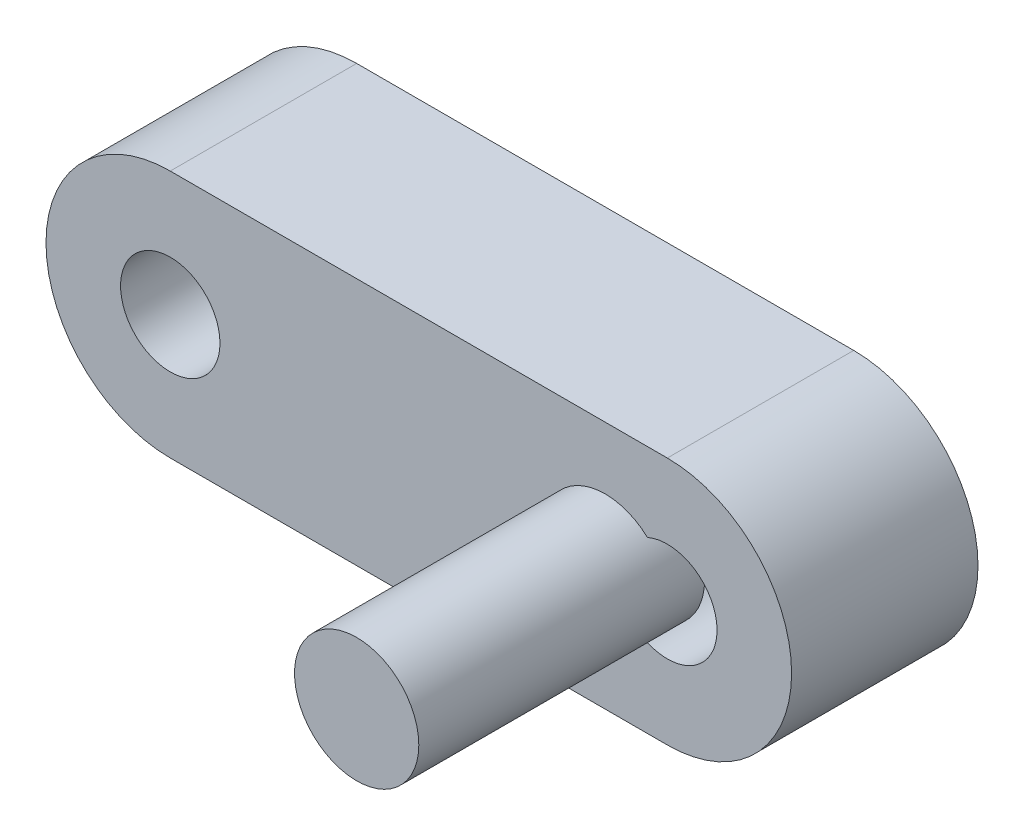
ISO-10303-21;
HEADER;
FILE_DESCRIPTION(('STEP AP214'),'2;1');
FILE_NAME('part.step','',(''),(''),'','','');
FILE_SCHEMA(('AUTOMOTIVE_DESIGN { 1 0 10303 214 1 1 1 1 }'));
ENDSEC;
DATA;
#1=APPLICATION_CONTEXT('core data for automotive mechanical design processes');
#2=APPLICATION_PROTOCOL_DEFINITION('international standard','automotive_design',2000,#1);
#3=PRODUCT_CONTEXT('',#1,'mechanical');
#4=PRODUCT('Part','Part','',(#3));
#5=PRODUCT_RELATED_PRODUCT_CATEGORY('part','',(#4));
#6=PRODUCT_DEFINITION_FORMATION('','',#4);
#7=PRODUCT_DEFINITION_CONTEXT('part definition',#1,'design');
#8=PRODUCT_DEFINITION('design','',#6,#7);
#9=PRODUCT_DEFINITION_SHAPE('','',#8);
#10=(LENGTH_UNIT() NAMED_UNIT(*) SI_UNIT(.MILLI.,.METRE.));
#11=(NAMED_UNIT(*) PLANE_ANGLE_UNIT() SI_UNIT($,.RADIAN.));
#12=(NAMED_UNIT(*) SI_UNIT($,.STERADIAN.) SOLID_ANGLE_UNIT());
#13=UNCERTAINTY_MEASURE_WITH_UNIT(LENGTH_MEASURE(1.E-05),#10,'distance_accuracy_value','');
#14=(GEOMETRIC_REPRESENTATION_CONTEXT(3) GLOBAL_UNCERTAINTY_ASSIGNED_CONTEXT((#13)) GLOBAL_UNIT_ASSIGNED_CONTEXT((#10,
#11,#12)) REPRESENTATION_CONTEXT('',''));
#15=CARTESIAN_POINT('',(0.,0.,0.));
#16=DIRECTION('',(0.,0.,1.));
#17=DIRECTION('',(1.,0.,0.));
#18=AXIS2_PLACEMENT_3D('',#15,#16,#17);
#19=CARTESIAN_POINT('',(10.,0.,7.5));
#20=DIRECTION('',(0.,0.,-1.));
#21=DIRECTION('',(-1.,0.,0.));
#22=AXIS2_PLACEMENT_3D('',#19,#20,#21);
#23=CYLINDRICAL_SURFACE('',#22,2.);
#24=DIRECTION('',(0.,0.,1.));
#25=VECTOR('',#24,1.);
#26=CARTESIAN_POINT('',(9.2,1.83303027798234,11.75));
#27=LINE('',#26,#25);
#28=CARTESIAN_POINT('',(9.2,1.83303027798233,6.));
#29=VERTEX_POINT('',#28);
#30=CARTESIAN_POINT('',(9.2,1.83303027798233,7.5));
#31=VERTEX_POINT('',#30);
#32=EDGE_CURVE('E284',#29,#31,#27,.T.);
#33=ORIENTED_EDGE('',*,*,#32,.F.);
#34=CARTESIAN_POINT('',(10.,0.,6.));
#35=DIRECTION('',(0.,0.,1.));
#36=DIRECTION('',(1.,0.,0.));
#37=AXIS2_PLACEMENT_3D('',#34,#35,#36);
#38=CIRCLE('',#37,2.);
#39=CARTESIAN_POINT('',(9.2,-1.83303027798234,6.));
#40=VERTEX_POINT('',#39);
#41=EDGE_CURVE('E277',#29,#40,#38,.T.);
#42=ORIENTED_EDGE('',*,*,#41,.T.);
#43=DIRECTION('',(0.,0.,1.));
#44=VECTOR('',#43,1.);
#45=CARTESIAN_POINT('',(9.2,-1.83303027798234,11.75));
#46=LINE('',#45,#44);
#47=CARTESIAN_POINT('',(9.2,-1.83303027798234,7.5));
#48=VERTEX_POINT('',#47);
#49=EDGE_CURVE('E281',#48,#40,#46,.F.);
#50=ORIENTED_EDGE('',*,*,#49,.F.);
#51=CARTESIAN_POINT('',(10.,0.,7.5));
#52=DIRECTION('',(0.,0.,1.));
#53=DIRECTION('',(1.,0.,0.));
#54=AXIS2_PLACEMENT_3D('',#51,#52,#53);
#55=CIRCLE('',#54,2.);
#56=EDGE_CURVE('E223',#48,#31,#55,.T.);
#57=ORIENTED_EDGE('',*,*,#56,.T.);
#58=EDGE_LOOP('',(#33,#42,#50,#57));
#59=FACE_BOUND('',#58,.T.);
#60=CARTESIAN_POINT('',(10.,0.,4.));
#61=DIRECTION('',(0.,0.,-1.));
#62=DIRECTION('',(-1.,0.,0.));
#63=AXIS2_PLACEMENT_3D('',#60,#61,#62);
#64=CIRCLE('',#63,2.);
#65=CARTESIAN_POINT('',(8.,0.,4.));
#66=VERTEX_POINT('',#65);
#67=EDGE_CURVE('E197',#66,#66,#64,.T.);
#68=ORIENTED_EDGE('',*,*,#67,.T.);
#69=EDGE_LOOP('',(#68));
#70=FACE_BOUND('',#69,.T.);
#71=ADVANCED_FACE('F43',(#59,#70),#23,.F.);
#72=CARTESIAN_POINT('',(-10.,0.,7.5));
#73=DIRECTION('',(0.,0.,1.));
#74=DIRECTION('',(1.,0.,0.));
#75=AXIS2_PLACEMENT_3D('',#72,#73,#74);
#76=PLANE('',#75);
#77=CARTESIAN_POINT('',(7.5,0.,7.5));
#78=DIRECTION('',(0.,0.,1.));
#79=DIRECTION('',(1.,0.,0.));
#80=AXIS2_PLACEMENT_3D('',#77,#78,#79);
#81=CIRCLE('',#80,2.5);
#82=EDGE_CURVE('E220',#31,#48,#81,.T.);
#83=ORIENTED_EDGE('',*,*,#82,.F.);
#84=ORIENTED_EDGE('',*,*,#56,.F.);
#85=EDGE_LOOP('',(#83,#84));
#86=FACE_BOUND('',#85,.T.);
#87=CARTESIAN_POINT('',(-10.,0.,7.5));
#88=DIRECTION('',(0.,0.,1.));
#89=DIRECTION('',(1.,0.,0.));
#90=AXIS2_PLACEMENT_3D('',#87,#88,#89);
#91=CIRCLE('',#90,2.);
#92=CARTESIAN_POINT('',(-8.,0.,7.5));
#93=VERTEX_POINT('',#92);
#94=EDGE_CURVE('E228',#93,#93,#91,.T.);
#95=ORIENTED_EDGE('',*,*,#94,.F.);
#96=EDGE_LOOP('',(#95));
#97=FACE_BOUND('',#96,.T.);
#98=CARTESIAN_POINT('',(-10.,0.,7.5));
#99=DIRECTION('',(0.,0.,1.));
#100=DIRECTION('',(1.,0.,0.));
#101=AXIS2_PLACEMENT_3D('',#98,#99,#100);
#102=CIRCLE('',#101,5.);
#103=CARTESIAN_POINT('',(-10.,5.,7.5));
#104=VERTEX_POINT('',#103);
#105=CARTESIAN_POINT('',(-10.,-5.,7.5));
#106=VERTEX_POINT('',#105);
#107=EDGE_CURVE('E236',#104,#106,#102,.T.);
#108=ORIENTED_EDGE('',*,*,#107,.T.);
#109=DIRECTION('',(1.,0.,0.));
#110=VECTOR('',#109,1.);
#111=CARTESIAN_POINT('',(-10.,-5.,7.5));
#112=LINE('',#111,#110);
#113=CARTESIAN_POINT('',(10.,-5.,7.5));
#114=VERTEX_POINT('',#113);
#115=EDGE_CURVE('E240',#106,#114,#112,.T.);
#116=ORIENTED_EDGE('',*,*,#115,.T.);
#117=CARTESIAN_POINT('',(10.,0.,7.5));
#118=DIRECTION('',(0.,0.,1.));
#119=DIRECTION('',(1.,0.,0.));
#120=AXIS2_PLACEMENT_3D('',#117,#118,#119);
#121=CIRCLE('',#120,5.);
#122=CARTESIAN_POINT('',(10.,5.,7.5));
#123=VERTEX_POINT('',#122);
#124=EDGE_CURVE('E244',#114,#123,#121,.T.);
#125=ORIENTED_EDGE('',*,*,#124,.T.);
#126=DIRECTION('',(-1.,0.,0.));
#127=VECTOR('',#126,1.);
#128=CARTESIAN_POINT('',(-10.,5.,7.5));
#129=LINE('',#128,#127);
#130=EDGE_CURVE('E247',#123,#104,#129,.T.);
#131=ORIENTED_EDGE('',*,*,#130,.T.);
#132=EDGE_LOOP('',(#108,#116,#125,#131));
#133=FACE_BOUND('',#132,.T.);
#134=ADVANCED_FACE('F318',(#86,#97,#133),#76,.T.);
#135=CARTESIAN_POINT('',(-10.,0.,0.));
#136=DIRECTION('',(0.,0.,1.));
#137=DIRECTION('',(1.,0.,0.));
#138=AXIS2_PLACEMENT_3D('',#135,#136,#137);
#139=PLANE('',#138);
#140=CARTESIAN_POINT('',(10.,0.,0.));
#141=DIRECTION('',(0.,0.,-1.));
#142=DIRECTION('',(-1.,0.,0.));
#143=AXIS2_PLACEMENT_3D('',#140,#141,#142);
#144=CIRCLE('',#143,3.1);
#145=CARTESIAN_POINT('',(6.9,0.,0.));
#146=VERTEX_POINT('',#145);
#147=EDGE_CURVE('E182',#146,#146,#144,.T.);
#148=ORIENTED_EDGE('',*,*,#147,.F.);
#149=EDGE_LOOP('',(#148));
#150=FACE_BOUND('',#149,.T.);
#151=CARTESIAN_POINT('',(-10.,0.,0.));
#152=DIRECTION('',(0.,0.,1.));
#153=DIRECTION('',(1.,0.,0.));
#154=AXIS2_PLACEMENT_3D('',#151,#152,#153);
#155=CIRCLE('',#154,5.);
#156=CARTESIAN_POINT('',(-10.,5.,0.));
#157=VERTEX_POINT('',#156);
#158=CARTESIAN_POINT('',(-10.,-5.,0.));
#159=VERTEX_POINT('',#158);
#160=EDGE_CURVE('E232',#157,#159,#155,.T.);
#161=ORIENTED_EDGE('',*,*,#160,.F.);
#162=DIRECTION('',(-1.,0.,0.));
#163=VECTOR('',#162,1.);
#164=CARTESIAN_POINT('',(-10.,5.,0.));
#165=LINE('',#164,#163);
#166=CARTESIAN_POINT('',(10.,5.,0.));
#167=VERTEX_POINT('',#166);
#168=EDGE_CURVE('E241',#167,#157,#165,.T.);
#169=ORIENTED_EDGE('',*,*,#168,.F.);
#170=CARTESIAN_POINT('',(10.,0.,0.));
#171=DIRECTION('',(0.,0.,1.));
#172=DIRECTION('',(1.,0.,0.));
#173=AXIS2_PLACEMENT_3D('',#170,#171,#172);
#174=CIRCLE('',#173,5.);
#175=CARTESIAN_POINT('',(10.,-5.,0.));
#176=VERTEX_POINT('',#175);
#177=EDGE_CURVE('E257',#176,#167,#174,.T.);
#178=ORIENTED_EDGE('',*,*,#177,.F.);
#179=DIRECTION('',(1.,0.,0.));
#180=VECTOR('',#179,1.);
#181=CARTESIAN_POINT('',(-10.,-5.,0.));
#182=LINE('',#181,#180);
#183=EDGE_CURVE('E254',#159,#176,#182,.T.);
#184=ORIENTED_EDGE('',*,*,#183,.F.);
#185=EDGE_LOOP('',(#161,#169,#178,#184));
#186=FACE_BOUND('',#185,.T.);
#187=DIRECTION('',(0.999999910493183,0.00042310001910909,0.));
#188=VECTOR('',#187,1.);
#189=CARTESIAN_POINT('',(-9.11776528908946,2.79931577403312,0.));
#190=LINE('',#189,#188);
#191=CARTESIAN_POINT('',(-9.11776528908946,2.79931577403312,0.));
#192=VERTEX_POINT('',#191);
#193=CARTESIAN_POINT('',(-5.88460407101755,2.80068372472871,0.));
#194=VERTEX_POINT('',#193);
#195=EDGE_CURVE('E166',#192,#194,#190,.T.);
#196=ORIENTED_EDGE('',*,*,#195,.F.);
#197=DIRECTION('',(0.499633539881701,0.866236876278816,0.));
#198=VECTOR('',#197,1.);
#199=CARTESIAN_POINT('',(-10.7331612180719,-0.00136795069558796,0.));
#200=LINE('',#199,#198);
#201=CARTESIAN_POINT('',(-9.601885148998,1.95997565429055,0.));
#202=VERTEX_POINT('',#201);
#203=EDGE_CURVE('E188',#202,#192,#200,.T.);
#204=ORIENTED_EDGE('',*,*,#203,.F.);
#205=CARTESIAN_POINT('',(-10.,0.,0.));
#206=DIRECTION('',(0.,0.,1.));
#207=DIRECTION('',(1.,0.,0.));
#208=AXIS2_PLACEMENT_3D('',#205,#206,#207);
#209=CIRCLE('',#208,2.);
#210=CARTESIAN_POINT('',(-9.6013197651423,-1.95986072727983,0.));
#211=VERTEX_POINT('',#210);
#212=EDGE_CURVE('E227',#202,#211,#209,.T.);
#213=ORIENTED_EDGE('',*,*,#212,.T.);
#214=DIRECTION('',(-0.500366370611481,0.865813776259707,0.));
#215=VECTOR('',#214,1.);
#216=CARTESIAN_POINT('',(-9.11539592898245,-2.80068372472871,0.));
#217=LINE('',#216,#215);
#218=CARTESIAN_POINT('',(-9.11539592898245,-2.80068372472871,0.));
#219=VERTEX_POINT('',#218);
#220=EDGE_CURVE('E185',#219,#211,#217,.T.);
#221=ORIENTED_EDGE('',*,*,#220,.F.);
#222=DIRECTION('',(-0.999999910493183,-0.000423100019109493,0.));
#223=VECTOR('',#222,1.);
#224=CARTESIAN_POINT('',(-5.88223471091054,-2.79931577403312,0.));
#225=LINE('',#224,#223);
#226=CARTESIAN_POINT('',(-5.88223471091054,-2.79931577403312,0.));
#227=VERTEX_POINT('',#226);
#228=EDGE_CURVE('E181',#227,#219,#225,.T.);
#229=ORIENTED_EDGE('',*,*,#228,.F.);
#230=DIRECTION('',(-0.499633539881701,-0.866236876278816,0.));
#231=VECTOR('',#230,1.);
#232=CARTESIAN_POINT('',(-4.26683878192809,0.00136795069558876,0.));
#233=LINE('',#232,#231);
#234=CARTESIAN_POINT('',(-4.26683878192809,0.00136795069558876,0.));
#235=VERTEX_POINT('',#234);
#236=EDGE_CURVE('E146',#235,#227,#233,.T.);
#237=ORIENTED_EDGE('',*,*,#236,.F.);
#238=DIRECTION('',(0.500366370611482,-0.865813776259707,0.));
#239=VECTOR('',#238,1.);
#240=CARTESIAN_POINT('',(-5.88460407101755,2.80068372472871,0.));
#241=LINE('',#240,#239);
#242=EDGE_CURVE('E162',#194,#235,#241,.T.);
#243=ORIENTED_EDGE('',*,*,#242,.F.);
#244=EDGE_LOOP('',(#196,#204,#213,#221,#229,#237,#243));
#245=FACE_BOUND('',#244,.T.);
#246=ADVANCED_FACE('F316',(#150,#186,#245),#139,.F.);
#247=CARTESIAN_POINT('',(-10.,0.,7.5));
#248=DIRECTION('',(0.,0.,-1.));
#249=DIRECTION('',(-1.,0.,0.));
#250=AXIS2_PLACEMENT_3D('',#247,#248,#249);
#251=CYLINDRICAL_SURFACE('',#250,5.);
#252=ORIENTED_EDGE('',*,*,#160,.T.);
#253=DIRECTION('',(0.,0.,-1.));
#254=VECTOR('',#253,1.);
#255=CARTESIAN_POINT('',(-10.,-5.,7.5));
#256=LINE('',#255,#254);
#257=EDGE_CURVE('E273',#106,#159,#256,.T.);
#258=ORIENTED_EDGE('',*,*,#257,.F.);
#259=ORIENTED_EDGE('',*,*,#107,.F.);
#260=DIRECTION('',(0.,0.,-1.));
#261=VECTOR('',#260,1.);
#262=CARTESIAN_POINT('',(-10.,5.,7.5));
#263=LINE('',#262,#261);
#264=EDGE_CURVE('E250',#104,#157,#263,.T.);
#265=ORIENTED_EDGE('',*,*,#264,.T.);
#266=EDGE_LOOP('',(#252,#258,#259,#265));
#267=FACE_BOUND('',#266,.T.);
#268=ADVANCED_FACE('F45',(#267),#251,.T.);
#269=CARTESIAN_POINT('',(-10.,-5.,7.5));
#270=DIRECTION('',(0.,1.,0.));
#271=DIRECTION('',(0.,0.,1.));
#272=AXIS2_PLACEMENT_3D('',#269,#270,#271);
#273=PLANE('',#272);
#274=ORIENTED_EDGE('',*,*,#183,.T.);
#275=DIRECTION('',(0.,0.,-1.));
#276=VECTOR('',#275,1.);
#277=CARTESIAN_POINT('',(10.,-5.,7.5));
#278=LINE('',#277,#276);
#279=EDGE_CURVE('E269',#114,#176,#278,.T.);
#280=ORIENTED_EDGE('',*,*,#279,.F.);
#281=ORIENTED_EDGE('',*,*,#115,.F.);
#282=ORIENTED_EDGE('',*,*,#257,.T.);
#283=EDGE_LOOP('',(#274,#280,#281,#282));
#284=FACE_BOUND('',#283,.T.);
#285=ADVANCED_FACE('F325',(#284),#273,.F.);
#286=CARTESIAN_POINT('',(10.,0.,7.5));
#287=DIRECTION('',(0.,0.,-1.));
#288=DIRECTION('',(-1.,0.,0.));
#289=AXIS2_PLACEMENT_3D('',#286,#287,#288);
#290=CYLINDRICAL_SURFACE('',#289,5.);
#291=ORIENTED_EDGE('',*,*,#177,.T.);
#292=DIRECTION('',(0.,0.,-1.));
#293=VECTOR('',#292,1.);
#294=CARTESIAN_POINT('',(10.,5.,7.5));
#295=LINE('',#294,#293);
#296=EDGE_CURVE('E265',#123,#167,#295,.T.);
#297=ORIENTED_EDGE('',*,*,#296,.F.);
#298=ORIENTED_EDGE('',*,*,#124,.F.);
#299=ORIENTED_EDGE('',*,*,#279,.T.);
#300=EDGE_LOOP('',(#291,#297,#298,#299));
#301=FACE_BOUND('',#300,.T.);
#302=ADVANCED_FACE('F350',(#301),#290,.T.);
#303=CARTESIAN_POINT('',(-10.,5.,7.5));
#304=DIRECTION('',(0.,-1.,0.));
#305=DIRECTION('',(0.,0.,-1.));
#306=AXIS2_PLACEMENT_3D('',#303,#304,#305);
#307=PLANE('',#306);
#308=ORIENTED_EDGE('',*,*,#168,.T.);
#309=ORIENTED_EDGE('',*,*,#264,.F.);
#310=ORIENTED_EDGE('',*,*,#130,.F.);
#311=ORIENTED_EDGE('',*,*,#296,.T.);
#312=EDGE_LOOP('',(#308,#309,#310,#311));
#313=FACE_BOUND('',#312,.T.);
#314=ADVANCED_FACE('F345',(#313),#307,.F.);
#315=CARTESIAN_POINT('',(-10.,0.,7.5));
#316=DIRECTION('',(0.,0.,-1.));
#317=DIRECTION('',(-1.,0.,0.));
#318=AXIS2_PLACEMENT_3D('',#315,#316,#317);
#319=CYLINDRICAL_SURFACE('',#318,2.);
#320=DIRECTION('',(0.,0.,-1.));
#321=VECTOR('',#320,1.);
#322=CARTESIAN_POINT('',(-9.601885148998,1.95997565429055,7.5));
#323=LINE('',#322,#321);
#324=CARTESIAN_POINT('',(-9.601885148998,1.95997565429055,4.));
#325=VERTEX_POINT('',#324);
#326=EDGE_CURVE('E11',#325,#202,#323,.T.);
#327=ORIENTED_EDGE('',*,*,#326,.F.);
#328=CARTESIAN_POINT('',(-10.,0.,4.));
#329=DIRECTION('',(0.,0.,-1.));
#330=DIRECTION('',(-1.,0.,0.));
#331=AXIS2_PLACEMENT_3D('',#328,#329,#330);
#332=CIRCLE('',#331,2.);
#333=CARTESIAN_POINT('',(-9.6013197651423,-1.95986072727983,4.));
#334=VERTEX_POINT('',#333);
#335=EDGE_CURVE('E287',#325,#334,#332,.T.);
#336=ORIENTED_EDGE('',*,*,#335,.T.);
#337=DIRECTION('',(0.,0.,-1.));
#338=VECTOR('',#337,1.);
#339=CARTESIAN_POINT('',(-9.6013197651423,-1.95986072727983,7.5));
#340=LINE('',#339,#338);
#341=EDGE_CURVE('E52',#211,#334,#340,.F.);
#342=ORIENTED_EDGE('',*,*,#341,.F.);
#343=ORIENTED_EDGE('',*,*,#212,.F.);
#344=EDGE_LOOP('',(#327,#336,#342,#343));
#345=FACE_BOUND('',#344,.T.);
#346=ORIENTED_EDGE('',*,*,#94,.T.);
#347=EDGE_LOOP('',(#346));
#348=FACE_BOUND('',#347,.T.);
#349=ADVANCED_FACE('F301',(#345,#348),#319,.F.);
#350=CARTESIAN_POINT('',(7.5,0.,6.));
#351=DIRECTION('',(0.,0.,1.));
#352=DIRECTION('',(1.,0.,0.));
#353=AXIS2_PLACEMENT_3D('',#350,#351,#352);
#354=PLANE('',#353);
#355=ORIENTED_EDGE('',*,*,#41,.F.);
#356=CARTESIAN_POINT('',(7.5,0.,6.));
#357=DIRECTION('',(0.,0.,1.));
#358=DIRECTION('',(1.,0.,0.));
#359=AXIS2_PLACEMENT_3D('',#356,#357,#358);
#360=CIRCLE('',#359,2.5);
#361=EDGE_CURVE('E66',#40,#29,#360,.T.);
#362=ORIENTED_EDGE('',*,*,#361,.F.);
#363=EDGE_LOOP('',(#355,#362));
#364=FACE_BOUND('',#363,.T.);
#365=ADVANCED_FACE('F344',(#364),#354,.F.);
#366=CARTESIAN_POINT('',(7.5,0.,6.));
#367=DIRECTION('',(0.,0.,1.));
#368=DIRECTION('',(1.,0.,0.));
#369=AXIS2_PLACEMENT_3D('',#366,#367,#368);
#370=CYLINDRICAL_SURFACE('',#369,2.5);
#371=ORIENTED_EDGE('',*,*,#361,.T.);
#372=ORIENTED_EDGE('',*,*,#32,.T.);
#373=ORIENTED_EDGE('',*,*,#82,.T.);
#374=ORIENTED_EDGE('',*,*,#49,.T.);
#375=EDGE_LOOP('',(#371,#372,#373,#374));
#376=FACE_BOUND('',#375,.T.);
#377=CARTESIAN_POINT('',(7.5,0.,17.5));
#378=DIRECTION('',(0.,0.,1.));
#379=DIRECTION('',(1.,0.,0.));
#380=AXIS2_PLACEMENT_3D('',#377,#378,#379);
#381=CIRCLE('',#380,2.5);
#382=CARTESIAN_POINT('',(10.,0.,17.5));
#383=VERTEX_POINT('',#382);
#384=EDGE_CURVE('E214',#383,#383,#381,.T.);
#385=ORIENTED_EDGE('',*,*,#384,.F.);
#386=EDGE_LOOP('',(#385));
#387=FACE_BOUND('',#386,.T.);
#388=ADVANCED_FACE('F341',(#376,#387),#370,.T.);
#389=CARTESIAN_POINT('',(7.5,0.,17.5));
#390=DIRECTION('',(0.,0.,1.));
#391=DIRECTION('',(1.,0.,0.));
#392=AXIS2_PLACEMENT_3D('',#389,#390,#391);
#393=PLANE('',#392);
#394=ORIENTED_EDGE('',*,*,#384,.T.);
#395=EDGE_LOOP('',(#394));
#396=FACE_BOUND('',#395,.T.);
#397=ADVANCED_FACE('F409',(#396),#393,.T.);
#398=CARTESIAN_POINT('',(10.,0.,4.));
#399=DIRECTION('',(0.,0.,-1.));
#400=DIRECTION('',(-1.,0.,0.));
#401=AXIS2_PLACEMENT_3D('',#398,#399,#400);
#402=CYLINDRICAL_SURFACE('',#401,3.1);
#403=CARTESIAN_POINT('',(10.,0.,4.));
#404=DIRECTION('',(0.,0.,-1.));
#405=DIRECTION('',(-1.,0.,0.));
#406=AXIS2_PLACEMENT_3D('',#403,#404,#405);
#407=CIRCLE('',#406,3.1);
#408=CARTESIAN_POINT('',(6.9,0.,4.));
#409=VERTEX_POINT('',#408);
#410=EDGE_CURVE('E210',#409,#409,#407,.T.);
#411=ORIENTED_EDGE('',*,*,#410,.F.);
#412=EDGE_LOOP('',(#411));
#413=FACE_BOUND('',#412,.T.);
#414=ORIENTED_EDGE('',*,*,#147,.T.);
#415=EDGE_LOOP('',(#414));
#416=FACE_BOUND('',#415,.T.);
#417=ADVANCED_FACE('F418',(#413,#416),#402,.F.);
#418=CARTESIAN_POINT('',(10.,0.,4.));
#419=DIRECTION('',(0.,0.,-1.));
#420=DIRECTION('',(-1.,0.,0.));
#421=AXIS2_PLACEMENT_3D('',#418,#419,#420);
#422=PLANE('',#421);
#423=ORIENTED_EDGE('',*,*,#67,.F.);
#424=EDGE_LOOP('',(#423));
#425=FACE_BOUND('',#424,.T.);
#426=ORIENTED_EDGE('',*,*,#410,.T.);
#427=EDGE_LOOP('',(#426));
#428=FACE_BOUND('',#427,.T.);
#429=ADVANCED_FACE('F444',(#425,#428),#422,.T.);
#430=CARTESIAN_POINT('',(-4.26683878192809,0.00136795069558876,4.));
#431=DIRECTION('',(0.866236876278816,-0.499633539881701,0.));
#432=DIRECTION('',(0.499633539881701,0.866236876278816,0.));
#433=AXIS2_PLACEMENT_3D('',#430,#431,#432);
#434=PLANE('',#433);
#435=ORIENTED_EDGE('',*,*,#236,.T.);
#436=DIRECTION('',(0.,0.,-1.));
#437=VECTOR('',#436,1.);
#438=CARTESIAN_POINT('',(-5.88223471091054,-2.79931577403312,4.));
#439=LINE('',#438,#437);
#440=CARTESIAN_POINT('',(-5.88223471091054,-2.79931577403312,4.));
#441=VERTEX_POINT('',#440);
#442=EDGE_CURVE('E139',#441,#227,#439,.T.);
#443=ORIENTED_EDGE('',*,*,#442,.F.);
#444=DIRECTION('',(-0.499633539881701,-0.866236876278816,0.));
#445=VECTOR('',#444,1.);
#446=CARTESIAN_POINT('',(-4.26683878192809,0.00136795069558876,4.));
#447=LINE('',#446,#445);
#448=CARTESIAN_POINT('',(-4.26683878192809,0.00136795069558876,4.));
#449=VERTEX_POINT('',#448);
#450=EDGE_CURVE('E143',#449,#441,#447,.T.);
#451=ORIENTED_EDGE('',*,*,#450,.F.);
#452=DIRECTION('',(0.,0.,-1.));
#453=VECTOR('',#452,1.);
#454=CARTESIAN_POINT('',(-4.26683878192809,0.00136795069558876,4.));
#455=LINE('',#454,#453);
#456=EDGE_CURVE('E194',#449,#235,#455,.T.);
#457=ORIENTED_EDGE('',*,*,#456,.T.);
#458=EDGE_LOOP('',(#435,#443,#451,#457));
#459=FACE_BOUND('',#458,.T.);
#460=ADVANCED_FACE('F141',(#459),#434,.F.);
#461=CARTESIAN_POINT('',(-5.88460407101755,2.80068372472871,4.));
#462=DIRECTION('',(0.865813776259707,0.500366370611482,0.));
#463=DIRECTION('',(-0.500366370611482,0.865813776259707,0.));
#464=AXIS2_PLACEMENT_3D('',#461,#462,#463);
#465=PLANE('',#464);
#466=ORIENTED_EDGE('',*,*,#242,.T.);
#467=ORIENTED_EDGE('',*,*,#456,.F.);
#468=DIRECTION('',(0.500366370611482,-0.865813776259707,0.));
#469=VECTOR('',#468,1.);
#470=CARTESIAN_POINT('',(-5.88460407101755,2.80068372472871,4.));
#471=LINE('',#470,#469);
#472=CARTESIAN_POINT('',(-5.88460407101755,2.80068372472871,4.));
#473=VERTEX_POINT('',#472);
#474=EDGE_CURVE('E152',#473,#449,#471,.T.);
#475=ORIENTED_EDGE('',*,*,#474,.F.);
#476=DIRECTION('',(0.,0.,-1.));
#477=VECTOR('',#476,1.);
#478=CARTESIAN_POINT('',(-5.88460407101755,2.80068372472871,4.));
#479=LINE('',#478,#477);
#480=EDGE_CURVE('E198',#473,#194,#479,.T.);
#481=ORIENTED_EDGE('',*,*,#480,.T.);
#482=EDGE_LOOP('',(#466,#467,#475,#481));
#483=FACE_BOUND('',#482,.T.);
#484=ADVANCED_FACE('F313',(#483),#465,.F.);
#485=CARTESIAN_POINT('',(-9.11776528908946,2.79931577403312,4.));
#486=DIRECTION('',(-0.00042310001910909,0.999999910493183,0.));
#487=DIRECTION('',(-0.999999910493183,-0.00042310001910909,0.));
#488=AXIS2_PLACEMENT_3D('',#485,#486,#487);
#489=PLANE('',#488);
#490=ORIENTED_EDGE('',*,*,#195,.T.);
#491=ORIENTED_EDGE('',*,*,#480,.F.);
#492=DIRECTION('',(0.999999910493183,0.00042310001910909,0.));
#493=VECTOR('',#492,1.);
#494=CARTESIAN_POINT('',(-9.11776528908946,2.79931577403312,4.));
#495=LINE('',#494,#493);
#496=CARTESIAN_POINT('',(-9.11776528908946,2.79931577403312,4.));
#497=VERTEX_POINT('',#496);
#498=EDGE_CURVE('E174',#497,#473,#495,.T.);
#499=ORIENTED_EDGE('',*,*,#498,.F.);
#500=DIRECTION('',(0.,0.,-1.));
#501=VECTOR('',#500,1.);
#502=CARTESIAN_POINT('',(-9.11776528908946,2.79931577403312,4.));
#503=LINE('',#502,#501);
#504=EDGE_CURVE('E201',#497,#192,#503,.T.);
#505=ORIENTED_EDGE('',*,*,#504,.T.);
#506=EDGE_LOOP('',(#490,#491,#499,#505));
#507=FACE_BOUND('',#506,.T.);
#508=ADVANCED_FACE('F311',(#507),#489,.F.);
#509=CARTESIAN_POINT('',(-10.7331612180719,-0.00136795069558796,4.));
#510=DIRECTION('',(-0.866236876278816,0.499633539881701,0.));
#511=DIRECTION('',(-0.499633539881701,-0.866236876278816,0.));
#512=AXIS2_PLACEMENT_3D('',#509,#510,#511);
#513=PLANE('',#512);
#514=ORIENTED_EDGE('',*,*,#326,.T.);
#515=ORIENTED_EDGE('',*,*,#203,.T.);
#516=ORIENTED_EDGE('',*,*,#504,.F.);
#517=DIRECTION('',(0.499633539881701,0.866236876278816,0.));
#518=VECTOR('',#517,1.);
#519=CARTESIAN_POINT('',(-10.7331612180719,-0.00136795069558796,4.));
#520=LINE('',#519,#518);
#521=EDGE_CURVE('E171',#325,#497,#520,.T.);
#522=ORIENTED_EDGE('',*,*,#521,.F.);
#523=EDGE_LOOP('',(#514,#515,#516,#522));
#524=FACE_BOUND('',#523,.T.);
#525=ADVANCED_FACE('F306',(#524),#513,.F.);
#526=CARTESIAN_POINT('',(-9.11539592898245,-2.80068372472871,4.));
#527=DIRECTION('',(-0.865813776259707,-0.500366370611481,0.));
#528=DIRECTION('',(0.500366370611481,-0.865813776259707,0.));
#529=AXIS2_PLACEMENT_3D('',#526,#527,#528);
#530=PLANE('',#529);
#531=ORIENTED_EDGE('',*,*,#341,.T.);
#532=DIRECTION('',(-0.500366370611481,0.865813776259707,0.));
#533=VECTOR('',#532,1.);
#534=CARTESIAN_POINT('',(-9.11539592898245,-2.80068372472871,4.));
#535=LINE('',#534,#533);
#536=CARTESIAN_POINT('',(-9.11539592898245,-2.80068372472871,4.));
#537=VERTEX_POINT('',#536);
#538=EDGE_CURVE('E59',#537,#334,#535,.T.);
#539=ORIENTED_EDGE('',*,*,#538,.F.);
#540=DIRECTION('',(0.,0.,-1.));
#541=VECTOR('',#540,1.);
#542=CARTESIAN_POINT('',(-9.11539592898245,-2.80068372472871,4.));
#543=LINE('',#542,#541);
#544=EDGE_CURVE('E151',#537,#219,#543,.T.);
#545=ORIENTED_EDGE('',*,*,#544,.T.);
#546=ORIENTED_EDGE('',*,*,#220,.T.);
#547=EDGE_LOOP('',(#531,#539,#545,#546));
#548=FACE_BOUND('',#547,.T.);
#549=ADVANCED_FACE('F296',(#548),#530,.F.);
#550=CARTESIAN_POINT('',(-5.88223471091054,-2.79931577403312,4.));
#551=DIRECTION('',(0.000423100019109493,-0.999999910493183,0.));
#552=DIRECTION('',(0.999999910493183,0.000423100019109493,0.));
#553=AXIS2_PLACEMENT_3D('',#550,#551,#552);
#554=PLANE('',#553);
#555=ORIENTED_EDGE('',*,*,#228,.T.);
#556=ORIENTED_EDGE('',*,*,#544,.F.);
#557=DIRECTION('',(-0.999999910493183,-0.000423100019109493,0.));
#558=VECTOR('',#557,1.);
#559=CARTESIAN_POINT('',(-5.88223471091054,-2.79931577403312,4.));
#560=LINE('',#559,#558);
#561=EDGE_CURVE('E154',#441,#537,#560,.T.);
#562=ORIENTED_EDGE('',*,*,#561,.F.);
#563=ORIENTED_EDGE('',*,*,#442,.T.);
#564=EDGE_LOOP('',(#555,#556,#562,#563));
#565=FACE_BOUND('',#564,.T.);
#566=ADVANCED_FACE('F155',(#565),#554,.F.);
#567=CARTESIAN_POINT('',(0.,0.,4.));
#568=DIRECTION('',(0.,0.,-1.));
#569=DIRECTION('',(-1.,0.,0.));
#570=AXIS2_PLACEMENT_3D('',#567,#568,#569);
#571=PLANE('',#570);
#572=ORIENTED_EDGE('',*,*,#521,.T.);
#573=ORIENTED_EDGE('',*,*,#498,.T.);
#574=ORIENTED_EDGE('',*,*,#474,.T.);
#575=ORIENTED_EDGE('',*,*,#450,.T.);
#576=ORIENTED_EDGE('',*,*,#561,.T.);
#577=ORIENTED_EDGE('',*,*,#538,.T.);
#578=ORIENTED_EDGE('',*,*,#335,.F.);
#579=EDGE_LOOP('',(#572,#573,#574,#575,#576,#577,#578));
#580=FACE_BOUND('',#579,.T.);
#581=ADVANCED_FACE('F158',(#580),#571,.T.);
#582=CLOSED_SHELL('',(#71,#134,#246,#268,#285,#302,#314,#349,#365,#388,#397,#417,#429,#460,#484,
#508,#525,#549,#566,#581));
#583=MANIFOLD_SOLID_BREP('B2',#582);
#584=ADVANCED_BREP_SHAPE_REPRESENTATION('',(#18,#583),#14);
#585=SHAPE_DEFINITION_REPRESENTATION(#9,#584);
ENDSEC;
END-ISO-10303-21;
